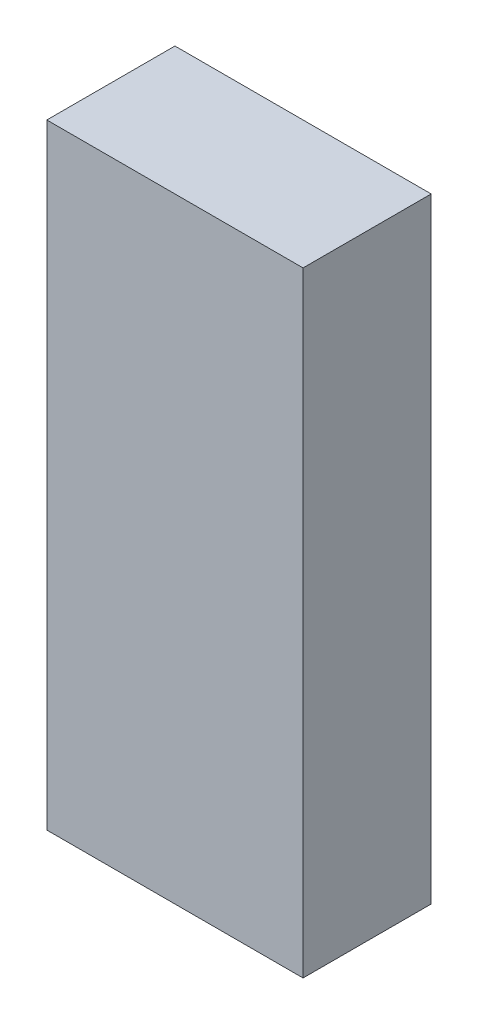
ISO-10303-21;
HEADER;
FILE_DESCRIPTION(('STEP AP214'),'2;1');
FILE_NAME('part.step','',(''),(''),'','','');
FILE_SCHEMA(('AUTOMOTIVE_DESIGN { 1 0 10303 214 1 1 1 1 }'));
ENDSEC;
DATA;
#1=APPLICATION_CONTEXT('core data for automotive mechanical design processes');
#2=APPLICATION_PROTOCOL_DEFINITION('international standard','automotive_design',2000,#1);
#3=PRODUCT_CONTEXT('',#1,'mechanical');
#4=PRODUCT('Part','Part','',(#3));
#5=PRODUCT_RELATED_PRODUCT_CATEGORY('part','',(#4));
#6=PRODUCT_DEFINITION_FORMATION('','',#4);
#7=PRODUCT_DEFINITION_CONTEXT('part definition',#1,'design');
#8=PRODUCT_DEFINITION('design','',#6,#7);
#9=PRODUCT_DEFINITION_SHAPE('','',#8);
#10=(LENGTH_UNIT() NAMED_UNIT(*) SI_UNIT(.MILLI.,.METRE.));
#11=(NAMED_UNIT(*) PLANE_ANGLE_UNIT() SI_UNIT($,.RADIAN.));
#12=(NAMED_UNIT(*) SI_UNIT($,.STERADIAN.) SOLID_ANGLE_UNIT());
#13=UNCERTAINTY_MEASURE_WITH_UNIT(LENGTH_MEASURE(1.E-05),#10,'distance_accuracy_value','');
#14=(GEOMETRIC_REPRESENTATION_CONTEXT(3) GLOBAL_UNCERTAINTY_ASSIGNED_CONTEXT((#13)) GLOBAL_UNIT_ASSIGNED_CONTEXT((#10,
#11,#12)) REPRESENTATION_CONTEXT('',''));
#15=CARTESIAN_POINT('',(0.,0.,0.));
#16=DIRECTION('',(0.,0.,1.));
#17=DIRECTION('',(1.,0.,0.));
#18=AXIS2_PLACEMENT_3D('',#15,#16,#17);
#19=CARTESIAN_POINT('',(0.,0.,0.25));
#20=DIRECTION('',(1.,0.,0.));
#21=DIRECTION('',(0.,1.,0.));
#22=AXIS2_PLACEMENT_3D('',#19,#20,#21);
#23=PLANE('',#22);
#24=DIRECTION('',(0.,-1.,0.));
#25=VECTOR('',#24,1.);
#26=CARTESIAN_POINT('',(0.,0.,0.));
#27=LINE('',#26,#25);
#28=CARTESIAN_POINT('',(0.,0.,0.));
#29=VERTEX_POINT('',#28);
#30=CARTESIAN_POINT('',(0.,-1.2,0.));
#31=VERTEX_POINT('',#30);
#32=EDGE_CURVE('E11',#29,#31,#27,.T.);
#33=ORIENTED_EDGE('',*,*,#32,.T.);
#34=DIRECTION('',(0.,0.,-1.));
#35=VECTOR('',#34,1.);
#36=CARTESIAN_POINT('',(0.,-1.2,0.25));
#37=LINE('',#36,#35);
#38=CARTESIAN_POINT('',(0.,-1.2,0.25));
#39=VERTEX_POINT('',#38);
#40=EDGE_CURVE('E23',#39,#31,#37,.T.);
#41=ORIENTED_EDGE('',*,*,#40,.F.);
#42=DIRECTION('',(0.,-1.,0.));
#43=VECTOR('',#42,1.);
#44=CARTESIAN_POINT('',(0.,0.,0.25));
#45=LINE('',#44,#43);
#46=CARTESIAN_POINT('',(0.,0.,0.25));
#47=VERTEX_POINT('',#46);
#48=EDGE_CURVE('E87',#47,#39,#45,.T.);
#49=ORIENTED_EDGE('',*,*,#48,.F.);
#50=DIRECTION('',(0.,0.,-1.));
#51=VECTOR('',#50,1.);
#52=CARTESIAN_POINT('',(0.,0.,0.25));
#53=LINE('',#52,#51);
#54=EDGE_CURVE('E76',#47,#29,#53,.T.);
#55=ORIENTED_EDGE('',*,*,#54,.T.);
#56=EDGE_LOOP('',(#33,#41,#49,#55));
#57=FACE_BOUND('',#56,.T.);
#58=ADVANCED_FACE('F16',(#57),#23,.F.);
#59=CARTESIAN_POINT('',(0.,-1.2,0.25));
#60=DIRECTION('',(0.,1.,0.));
#61=DIRECTION('',(0.,0.,1.));
#62=AXIS2_PLACEMENT_3D('',#59,#60,#61);
#63=PLANE('',#62);
#64=DIRECTION('',(1.,0.,0.));
#65=VECTOR('',#64,1.);
#66=CARTESIAN_POINT('',(0.,-1.2,0.));
#67=LINE('',#66,#65);
#68=CARTESIAN_POINT('',(0.5,-1.2,0.));
#69=VERTEX_POINT('',#68);
#70=EDGE_CURVE('E84',#31,#69,#67,.T.);
#71=ORIENTED_EDGE('',*,*,#70,.T.);
#72=DIRECTION('',(0.,0.,-1.));
#73=VECTOR('',#72,1.);
#74=CARTESIAN_POINT('',(0.5,-1.2,0.25));
#75=LINE('',#74,#73);
#76=CARTESIAN_POINT('',(0.5,-1.2,0.25));
#77=VERTEX_POINT('',#76);
#78=EDGE_CURVE('E82',#77,#69,#75,.T.);
#79=ORIENTED_EDGE('',*,*,#78,.F.);
#80=DIRECTION('',(1.,0.,0.));
#81=VECTOR('',#80,1.);
#82=CARTESIAN_POINT('',(0.,-1.2,0.25));
#83=LINE('',#82,#81);
#84=EDGE_CURVE('E71',#39,#77,#83,.T.);
#85=ORIENTED_EDGE('',*,*,#84,.F.);
#86=ORIENTED_EDGE('',*,*,#40,.T.);
#87=EDGE_LOOP('',(#71,#79,#85,#86));
#88=FACE_BOUND('',#87,.T.);
#89=ADVANCED_FACE('F89',(#88),#63,.F.);
#90=CARTESIAN_POINT('',(0.5,0.,0.25));
#91=DIRECTION('',(-1.,0.,0.));
#92=DIRECTION('',(0.,0.,1.));
#93=AXIS2_PLACEMENT_3D('',#90,#91,#92);
#94=PLANE('',#93);
#95=DIRECTION('',(0.,1.,0.));
#96=VECTOR('',#95,1.);
#97=CARTESIAN_POINT('',(0.5,0.,0.));
#98=LINE('',#97,#96);
#99=CARTESIAN_POINT('',(0.5,0.,0.));
#100=VERTEX_POINT('',#99);
#101=EDGE_CURVE('E59',#69,#100,#98,.T.);
#102=ORIENTED_EDGE('',*,*,#101,.T.);
#103=DIRECTION('',(0.,0.,-1.));
#104=VECTOR('',#103,1.);
#105=CARTESIAN_POINT('',(0.5,0.,0.25));
#106=LINE('',#105,#104);
#107=CARTESIAN_POINT('',(0.5,0.,0.25));
#108=VERTEX_POINT('',#107);
#109=EDGE_CURVE('E53',#108,#100,#106,.T.);
#110=ORIENTED_EDGE('',*,*,#109,.F.);
#111=DIRECTION('',(0.,1.,0.));
#112=VECTOR('',#111,1.);
#113=CARTESIAN_POINT('',(0.5,0.,0.25));
#114=LINE('',#113,#112);
#115=EDGE_CURVE('E57',#77,#108,#114,.T.);
#116=ORIENTED_EDGE('',*,*,#115,.F.);
#117=ORIENTED_EDGE('',*,*,#78,.T.);
#118=EDGE_LOOP('',(#102,#110,#116,#117));
#119=FACE_BOUND('',#118,.T.);
#120=ADVANCED_FACE('F55',(#119),#94,.F.);
#121=CARTESIAN_POINT('',(0.,0.,0.25));
#122=DIRECTION('',(0.,-1.,0.));
#123=DIRECTION('',(0.,0.,-1.));
#124=AXIS2_PLACEMENT_3D('',#121,#122,#123);
#125=PLANE('',#124);
#126=DIRECTION('',(-1.,0.,0.));
#127=VECTOR('',#126,1.);
#128=CARTESIAN_POINT('',(0.,0.,0.));
#129=LINE('',#128,#127);
#130=EDGE_CURVE('E72',#100,#29,#129,.T.);
#131=ORIENTED_EDGE('',*,*,#130,.T.);
#132=ORIENTED_EDGE('',*,*,#54,.F.);
#133=DIRECTION('',(-1.,0.,0.));
#134=VECTOR('',#133,1.);
#135=CARTESIAN_POINT('',(0.,0.,0.25));
#136=LINE('',#135,#134);
#137=EDGE_CURVE('E69',#108,#47,#136,.T.);
#138=ORIENTED_EDGE('',*,*,#137,.F.);
#139=ORIENTED_EDGE('',*,*,#109,.T.);
#140=EDGE_LOOP('',(#131,#132,#138,#139));
#141=FACE_BOUND('',#140,.T.);
#142=ADVANCED_FACE('F75',(#141),#125,.F.);
#143=CARTESIAN_POINT('',(0.,-1.2,0.25));
#144=DIRECTION('',(0.,0.,1.));
#145=DIRECTION('',(1.,0.,0.));
#146=AXIS2_PLACEMENT_3D('',#143,#144,#145);
#147=PLANE('',#146);
#148=ORIENTED_EDGE('',*,*,#48,.T.);
#149=ORIENTED_EDGE('',*,*,#84,.T.);
#150=ORIENTED_EDGE('',*,*,#115,.T.);
#151=ORIENTED_EDGE('',*,*,#137,.T.);
#152=EDGE_LOOP('',(#148,#149,#150,#151));
#153=FACE_BOUND('',#152,.T.);
#154=ADVANCED_FACE('F68',(#153),#147,.T.);
#155=CARTESIAN_POINT('',(0.,-1.2,0.));
#156=DIRECTION('',(0.,0.,1.));
#157=DIRECTION('',(1.,0.,0.));
#158=AXIS2_PLACEMENT_3D('',#155,#156,#157);
#159=PLANE('',#158);
#160=ORIENTED_EDGE('',*,*,#32,.F.);
#161=ORIENTED_EDGE('',*,*,#130,.F.);
#162=ORIENTED_EDGE('',*,*,#101,.F.);
#163=ORIENTED_EDGE('',*,*,#70,.F.);
#164=EDGE_LOOP('',(#160,#161,#162,#163));
#165=FACE_BOUND('',#164,.T.);
#166=ADVANCED_FACE('F90',(#165),#159,.F.);
#167=CLOSED_SHELL('',(#58,#89,#120,#142,#154,#166));
#168=MANIFOLD_SOLID_BREP('B1',#167);
#169=ADVANCED_BREP_SHAPE_REPRESENTATION('',(#18,#168),#14);
#170=SHAPE_DEFINITION_REPRESENTATION(#9,#169);
ENDSEC;
END-ISO-10303-21;
